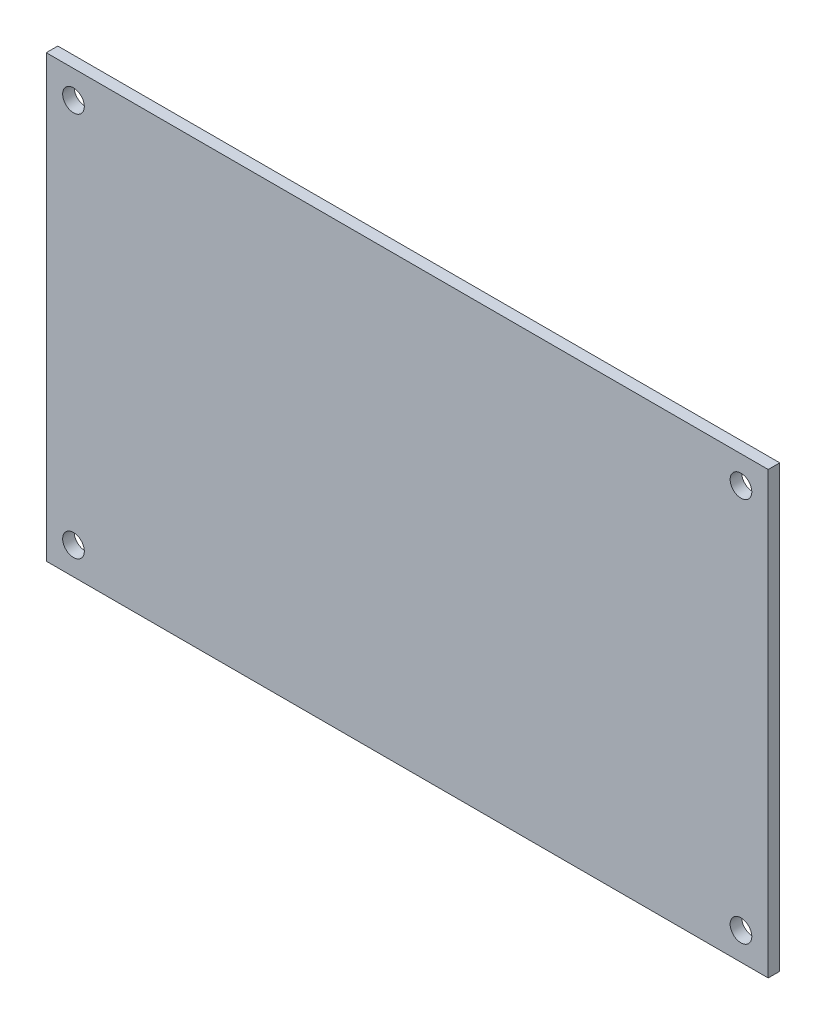
ISO-10303-21;
HEADER;
FILE_DESCRIPTION(('STEP AP214'),'2;1');
FILE_NAME('part.step','',(''),(''),'','','');
FILE_SCHEMA(('AUTOMOTIVE_DESIGN { 1 0 10303 214 1 1 1 1 }'));
ENDSEC;
DATA;
#1=APPLICATION_CONTEXT('core data for automotive mechanical design processes');
#2=APPLICATION_PROTOCOL_DEFINITION('international standard','automotive_design',2000,#1);
#3=PRODUCT_CONTEXT('',#1,'mechanical');
#4=PRODUCT('Part','Part','',(#3));
#5=PRODUCT_RELATED_PRODUCT_CATEGORY('part','',(#4));
#6=PRODUCT_DEFINITION_FORMATION('','',#4);
#7=PRODUCT_DEFINITION_CONTEXT('part definition',#1,'design');
#8=PRODUCT_DEFINITION('design','',#6,#7);
#9=PRODUCT_DEFINITION_SHAPE('','',#8);
#10=(LENGTH_UNIT() NAMED_UNIT(*) SI_UNIT(.MILLI.,.METRE.));
#11=(NAMED_UNIT(*) PLANE_ANGLE_UNIT() SI_UNIT($,.RADIAN.));
#12=(NAMED_UNIT(*) SI_UNIT($,.STERADIAN.) SOLID_ANGLE_UNIT());
#13=UNCERTAINTY_MEASURE_WITH_UNIT(LENGTH_MEASURE(1.E-05),#10,'distance_accuracy_value','');
#14=(GEOMETRIC_REPRESENTATION_CONTEXT(3) GLOBAL_UNCERTAINTY_ASSIGNED_CONTEXT((#13)) GLOBAL_UNIT_ASSIGNED_CONTEXT((#10,
#11,#12)) REPRESENTATION_CONTEXT('',''));
#15=CARTESIAN_POINT('',(0.,0.,0.));
#16=DIRECTION('',(0.,0.,1.));
#17=DIRECTION('',(1.,0.,0.));
#18=AXIS2_PLACEMENT_3D('',#15,#16,#17);
#19=CARTESIAN_POINT('',(0.,61.,1.6));
#20=DIRECTION('',(0.,0.,-1.));
#21=DIRECTION('',(-1.,0.,0.));
#22=AXIS2_PLACEMENT_3D('',#19,#20,#21);
#23=PLANE('',#22);
#24=CARTESIAN_POINT('',(3.77200000000002,57.17,1.6));
#25=DIRECTION('',(0.,0.,1.));
#26=DIRECTION('',(1.,0.,0.));
#27=AXIS2_PLACEMENT_3D('',#24,#25,#26);
#28=CIRCLE('',#27,1.5);
#29=CARTESIAN_POINT('',(5.27200000000002,57.17,1.6));
#30=VERTEX_POINT('',#29);
#31=EDGE_CURVE('E122',#30,#30,#28,.T.);
#32=ORIENTED_EDGE('',*,*,#31,.F.);
#33=EDGE_LOOP('',(#32));
#34=FACE_BOUND('',#33,.T.);
#35=CARTESIAN_POINT('',(3.77200000000001,3.83000000000001,1.6));
#36=DIRECTION('',(0.,0.,1.));
#37=DIRECTION('',(1.,0.,0.));
#38=AXIS2_PLACEMENT_3D('',#35,#36,#37);
#39=CIRCLE('',#38,1.5);
#40=CARTESIAN_POINT('',(5.27200000000001,3.83000000000001,1.6));
#41=VERTEX_POINT('',#40);
#42=EDGE_CURVE('E101',#41,#41,#39,.T.);
#43=ORIENTED_EDGE('',*,*,#42,.F.);
#44=EDGE_LOOP('',(#43));
#45=FACE_BOUND('',#44,.T.);
#46=DIRECTION('',(0.,-1.,0.));
#47=VECTOR('',#46,1.);
#48=CARTESIAN_POINT('',(0.,0.,1.6));
#49=LINE('',#48,#47);
#50=CARTESIAN_POINT('',(0.,61.,1.6));
#51=VERTEX_POINT('',#50);
#52=CARTESIAN_POINT('',(0.,0.,1.6));
#53=VERTEX_POINT('',#52);
#54=EDGE_CURVE('E86',#51,#53,#49,.T.);
#55=ORIENTED_EDGE('',*,*,#54,.T.);
#56=DIRECTION('',(1.,0.,0.));
#57=VECTOR('',#56,1.);
#58=CARTESIAN_POINT('',(0.,0.,1.6));
#59=LINE('',#58,#57);
#60=CARTESIAN_POINT('',(100.,0.,1.6));
#61=VERTEX_POINT('',#60);
#62=EDGE_CURVE('E81',#53,#61,#59,.T.);
#63=ORIENTED_EDGE('',*,*,#62,.T.);
#64=DIRECTION('',(0.,1.,0.));
#65=VECTOR('',#64,1.);
#66=CARTESIAN_POINT('',(100.,0.,1.6));
#67=LINE('',#66,#65);
#68=CARTESIAN_POINT('',(100.,61.,1.6));
#69=VERTEX_POINT('',#68);
#70=EDGE_CURVE('E84',#61,#69,#67,.T.);
#71=ORIENTED_EDGE('',*,*,#70,.T.);
#72=DIRECTION('',(-1.,0.,0.));
#73=VECTOR('',#72,1.);
#74=CARTESIAN_POINT('',(0.,61.,1.6));
#75=LINE('',#74,#73);
#76=EDGE_CURVE('E51',#69,#51,#75,.T.);
#77=ORIENTED_EDGE('',*,*,#76,.T.);
#78=EDGE_LOOP('',(#55,#63,#71,#77));
#79=FACE_BOUND('',#78,.T.);
#80=CARTESIAN_POINT('',(96.228,3.83000000000001,1.6));
#81=DIRECTION('',(0.,0.,1.));
#82=DIRECTION('',(1.,0.,0.));
#83=AXIS2_PLACEMENT_3D('',#80,#81,#82);
#84=CIRCLE('',#83,1.5);
#85=CARTESIAN_POINT('',(97.728,3.83000000000001,1.6));
#86=VERTEX_POINT('',#85);
#87=EDGE_CURVE('E116',#86,#86,#84,.T.);
#88=ORIENTED_EDGE('',*,*,#87,.F.);
#89=EDGE_LOOP('',(#88));
#90=FACE_BOUND('',#89,.T.);
#91=CARTESIAN_POINT('',(96.228,57.17,1.6));
#92=DIRECTION('',(0.,0.,1.));
#93=DIRECTION('',(1.,0.,0.));
#94=AXIS2_PLACEMENT_3D('',#91,#92,#93);
#95=CIRCLE('',#94,1.5);
#96=CARTESIAN_POINT('',(97.728,57.17,1.6));
#97=VERTEX_POINT('',#96);
#98=EDGE_CURVE('E128',#97,#97,#95,.T.);
#99=ORIENTED_EDGE('',*,*,#98,.F.);
#100=EDGE_LOOP('',(#99));
#101=FACE_BOUND('',#100,.T.);
#102=ADVANCED_FACE('F34',(#34,#45,#79,#90,#101),#23,.F.);
#103=CARTESIAN_POINT('',(0.,61.,0.));
#104=DIRECTION('',(0.,0.,-1.));
#105=DIRECTION('',(-1.,0.,0.));
#106=AXIS2_PLACEMENT_3D('',#103,#104,#105);
#107=PLANE('',#106);
#108=CARTESIAN_POINT('',(3.77200000000002,57.17,0.));
#109=DIRECTION('',(0.,0.,1.));
#110=DIRECTION('',(1.,0.,0.));
#111=AXIS2_PLACEMENT_3D('',#108,#109,#110);
#112=CIRCLE('',#111,1.5);
#113=CARTESIAN_POINT('',(5.27200000000002,57.17,0.));
#114=VERTEX_POINT('',#113);
#115=EDGE_CURVE('E125',#114,#114,#112,.T.);
#116=ORIENTED_EDGE('',*,*,#115,.T.);
#117=EDGE_LOOP('',(#116));
#118=FACE_BOUND('',#117,.T.);
#119=CARTESIAN_POINT('',(3.77200000000001,3.83000000000001,0.));
#120=DIRECTION('',(0.,0.,1.));
#121=DIRECTION('',(1.,0.,0.));
#122=AXIS2_PLACEMENT_3D('',#119,#120,#121);
#123=CIRCLE('',#122,1.5);
#124=CARTESIAN_POINT('',(5.27200000000001,3.83000000000001,0.));
#125=VERTEX_POINT('',#124);
#126=EDGE_CURVE('E113',#125,#125,#123,.T.);
#127=ORIENTED_EDGE('',*,*,#126,.T.);
#128=EDGE_LOOP('',(#127));
#129=FACE_BOUND('',#128,.T.);
#130=DIRECTION('',(0.,-1.,0.));
#131=VECTOR('',#130,1.);
#132=CARTESIAN_POINT('',(0.,0.,0.));
#133=LINE('',#132,#131);
#134=CARTESIAN_POINT('',(0.,61.,0.));
#135=VERTEX_POINT('',#134);
#136=CARTESIAN_POINT('',(0.,0.,0.));
#137=VERTEX_POINT('',#136);
#138=EDGE_CURVE('E98',#135,#137,#133,.T.);
#139=ORIENTED_EDGE('',*,*,#138,.F.);
#140=DIRECTION('',(-1.,0.,0.));
#141=VECTOR('',#140,1.);
#142=CARTESIAN_POINT('',(0.,61.,0.));
#143=LINE('',#142,#141);
#144=CARTESIAN_POINT('',(100.,61.,0.));
#145=VERTEX_POINT('',#144);
#146=EDGE_CURVE('E74',#145,#135,#143,.T.);
#147=ORIENTED_EDGE('',*,*,#146,.F.);
#148=DIRECTION('',(0.,1.,0.));
#149=VECTOR('',#148,1.);
#150=CARTESIAN_POINT('',(100.,0.,0.));
#151=LINE('',#150,#149);
#152=CARTESIAN_POINT('',(100.,0.,0.));
#153=VERTEX_POINT('',#152);
#154=EDGE_CURVE('E68',#153,#145,#151,.T.);
#155=ORIENTED_EDGE('',*,*,#154,.F.);
#156=DIRECTION('',(1.,0.,0.));
#157=VECTOR('',#156,1.);
#158=CARTESIAN_POINT('',(0.,0.,0.));
#159=LINE('',#158,#157);
#160=EDGE_CURVE('E90',#137,#153,#159,.T.);
#161=ORIENTED_EDGE('',*,*,#160,.F.);
#162=EDGE_LOOP('',(#139,#147,#155,#161));
#163=FACE_BOUND('',#162,.T.);
#164=CARTESIAN_POINT('',(96.228,3.83000000000001,0.));
#165=DIRECTION('',(0.,0.,1.));
#166=DIRECTION('',(1.,0.,0.));
#167=AXIS2_PLACEMENT_3D('',#164,#165,#166);
#168=CIRCLE('',#167,1.5);
#169=CARTESIAN_POINT('',(97.728,3.83000000000001,0.));
#170=VERTEX_POINT('',#169);
#171=EDGE_CURVE('E119',#170,#170,#168,.T.);
#172=ORIENTED_EDGE('',*,*,#171,.T.);
#173=EDGE_LOOP('',(#172));
#174=FACE_BOUND('',#173,.T.);
#175=CARTESIAN_POINT('',(96.228,57.17,0.));
#176=DIRECTION('',(0.,0.,1.));
#177=DIRECTION('',(1.,0.,0.));
#178=AXIS2_PLACEMENT_3D('',#175,#176,#177);
#179=CIRCLE('',#178,1.5);
#180=CARTESIAN_POINT('',(97.728,57.17,0.));
#181=VERTEX_POINT('',#180);
#182=EDGE_CURVE('E131',#181,#181,#179,.T.);
#183=ORIENTED_EDGE('',*,*,#182,.T.);
#184=EDGE_LOOP('',(#183));
#185=FACE_BOUND('',#184,.T.);
#186=ADVANCED_FACE('F109',(#118,#129,#163,#174,#185),#107,.T.);
#187=CARTESIAN_POINT('',(0.,0.,1.6));
#188=DIRECTION('',(1.,0.,0.));
#189=DIRECTION('',(0.,0.,-1.));
#190=AXIS2_PLACEMENT_3D('',#187,#188,#189);
#191=PLANE('',#190);
#192=ORIENTED_EDGE('',*,*,#138,.T.);
#193=DIRECTION('',(0.,0.,-1.));
#194=VECTOR('',#193,1.);
#195=CARTESIAN_POINT('',(0.,0.,1.6));
#196=LINE('',#195,#194);
#197=EDGE_CURVE('E11',#53,#137,#196,.T.);
#198=ORIENTED_EDGE('',*,*,#197,.F.);
#199=ORIENTED_EDGE('',*,*,#54,.F.);
#200=DIRECTION('',(0.,0.,-1.));
#201=VECTOR('',#200,1.);
#202=CARTESIAN_POINT('',(0.,61.,1.6));
#203=LINE('',#202,#201);
#204=EDGE_CURVE('E94',#51,#135,#203,.T.);
#205=ORIENTED_EDGE('',*,*,#204,.T.);
#206=EDGE_LOOP('',(#192,#198,#199,#205));
#207=FACE_BOUND('',#206,.T.);
#208=ADVANCED_FACE('F36',(#207),#191,.F.);
#209=CARTESIAN_POINT('',(0.,0.,1.6));
#210=DIRECTION('',(0.,1.,0.));
#211=DIRECTION('',(0.,0.,1.));
#212=AXIS2_PLACEMENT_3D('',#209,#210,#211);
#213=PLANE('',#212);
#214=ORIENTED_EDGE('',*,*,#160,.T.);
#215=DIRECTION('',(0.,0.,-1.));
#216=VECTOR('',#215,1.);
#217=CARTESIAN_POINT('',(100.,0.,1.6));
#218=LINE('',#217,#216);
#219=EDGE_CURVE('E43',#61,#153,#218,.T.);
#220=ORIENTED_EDGE('',*,*,#219,.F.);
#221=ORIENTED_EDGE('',*,*,#62,.F.);
#222=ORIENTED_EDGE('',*,*,#197,.T.);
#223=EDGE_LOOP('',(#214,#220,#221,#222));
#224=FACE_BOUND('',#223,.T.);
#225=ADVANCED_FACE('F89',(#224),#213,.F.);
#226=CARTESIAN_POINT('',(100.,0.,1.6));
#227=DIRECTION('',(-1.,0.,0.));
#228=DIRECTION('',(0.,0.,1.));
#229=AXIS2_PLACEMENT_3D('',#226,#227,#228);
#230=PLANE('',#229);
#231=ORIENTED_EDGE('',*,*,#154,.T.);
#232=DIRECTION('',(0.,0.,-1.));
#233=VECTOR('',#232,1.);
#234=CARTESIAN_POINT('',(100.,61.,1.6));
#235=LINE('',#234,#233);
#236=EDGE_CURVE('E91',#69,#145,#235,.T.);
#237=ORIENTED_EDGE('',*,*,#236,.F.);
#238=ORIENTED_EDGE('',*,*,#70,.F.);
#239=ORIENTED_EDGE('',*,*,#219,.T.);
#240=EDGE_LOOP('',(#231,#237,#238,#239));
#241=FACE_BOUND('',#240,.T.);
#242=ADVANCED_FACE('F92',(#241),#230,.F.);
#243=CARTESIAN_POINT('',(0.,61.,1.6));
#244=DIRECTION('',(0.,-1.,0.));
#245=DIRECTION('',(0.,0.,-1.));
#246=AXIS2_PLACEMENT_3D('',#243,#244,#245);
#247=PLANE('',#246);
#248=ORIENTED_EDGE('',*,*,#146,.T.);
#249=ORIENTED_EDGE('',*,*,#204,.F.);
#250=ORIENTED_EDGE('',*,*,#76,.F.);
#251=ORIENTED_EDGE('',*,*,#236,.T.);
#252=EDGE_LOOP('',(#248,#249,#250,#251));
#253=FACE_BOUND('',#252,.T.);
#254=ADVANCED_FACE('F106',(#253),#247,.F.);
#255=CARTESIAN_POINT('',(3.77200000000001,3.83000000000001,1.6));
#256=DIRECTION('',(0.,0.,-1.));
#257=DIRECTION('',(-1.,0.,0.));
#258=AXIS2_PLACEMENT_3D('',#255,#256,#257);
#259=CYLINDRICAL_SURFACE('',#258,1.5);
#260=ORIENTED_EDGE('',*,*,#42,.T.);
#261=EDGE_LOOP('',(#260));
#262=FACE_BOUND('',#261,.T.);
#263=ORIENTED_EDGE('',*,*,#126,.F.);
#264=EDGE_LOOP('',(#263));
#265=FACE_BOUND('',#264,.T.);
#266=ADVANCED_FACE('F151',(#262,#265),#259,.F.);
#267=CARTESIAN_POINT('',(96.228,3.83000000000001,1.6));
#268=DIRECTION('',(0.,0.,-1.));
#269=DIRECTION('',(-1.,0.,0.));
#270=AXIS2_PLACEMENT_3D('',#267,#268,#269);
#271=CYLINDRICAL_SURFACE('',#270,1.5);
#272=ORIENTED_EDGE('',*,*,#87,.T.);
#273=EDGE_LOOP('',(#272));
#274=FACE_BOUND('',#273,.T.);
#275=ORIENTED_EDGE('',*,*,#171,.F.);
#276=EDGE_LOOP('',(#275));
#277=FACE_BOUND('',#276,.T.);
#278=ADVANCED_FACE('F205',(#274,#277),#271,.F.);
#279=CARTESIAN_POINT('',(3.77200000000002,57.17,1.6));
#280=DIRECTION('',(0.,0.,-1.));
#281=DIRECTION('',(-1.,0.,0.));
#282=AXIS2_PLACEMENT_3D('',#279,#280,#281);
#283=CYLINDRICAL_SURFACE('',#282,1.5);
#284=ORIENTED_EDGE('',*,*,#31,.T.);
#285=EDGE_LOOP('',(#284));
#286=FACE_BOUND('',#285,.T.);
#287=ORIENTED_EDGE('',*,*,#115,.F.);
#288=EDGE_LOOP('',(#287));
#289=FACE_BOUND('',#288,.T.);
#290=ADVANCED_FACE('F213',(#286,#289),#283,.F.);
#291=CARTESIAN_POINT('',(96.228,57.17,1.6));
#292=DIRECTION('',(0.,0.,-1.));
#293=DIRECTION('',(-1.,0.,0.));
#294=AXIS2_PLACEMENT_3D('',#291,#292,#293);
#295=CYLINDRICAL_SURFACE('',#294,1.5);
#296=ORIENTED_EDGE('',*,*,#98,.T.);
#297=EDGE_LOOP('',(#296));
#298=FACE_BOUND('',#297,.T.);
#299=ORIENTED_EDGE('',*,*,#182,.F.);
#300=EDGE_LOOP('',(#299));
#301=FACE_BOUND('',#300,.T.);
#302=ADVANCED_FACE('F137',(#298,#301),#295,.F.);
#303=CLOSED_SHELL('',(#102,#186,#208,#225,#242,#254,#266,#278,#290,#302));
#304=MANIFOLD_SOLID_BREP('B2',#303);
#305=ADVANCED_BREP_SHAPE_REPRESENTATION('',(#18,#304),#14);
#306=SHAPE_DEFINITION_REPRESENTATION(#9,#305);
ENDSEC;
END-ISO-10303-21;
